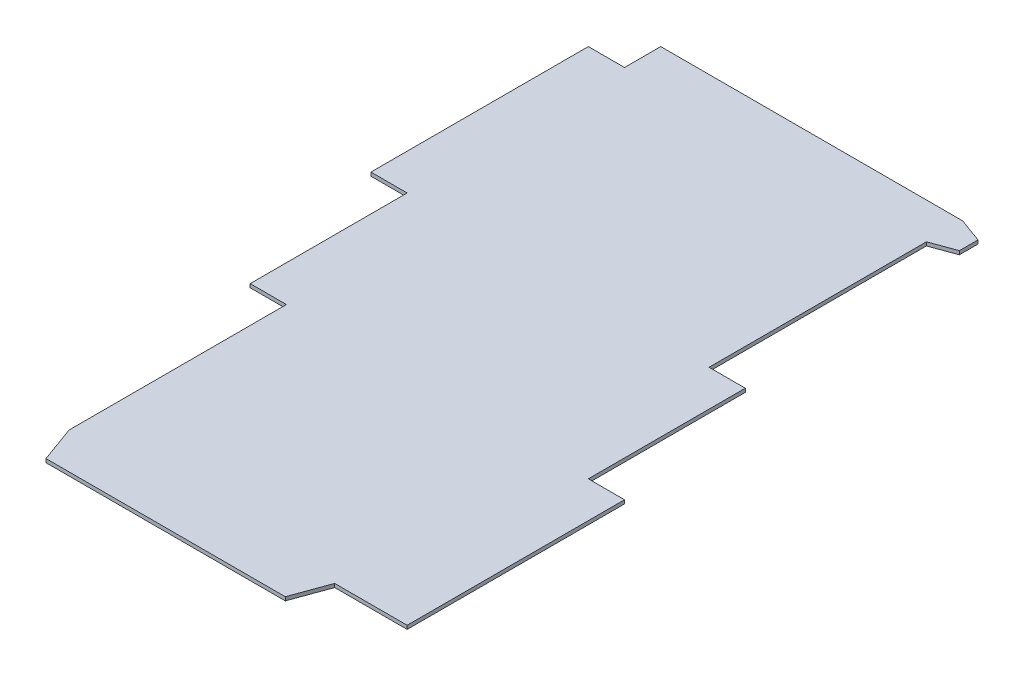
ISO-10303-21;
HEADER;
FILE_DESCRIPTION(('STEP AP214'),'2;1');
FILE_NAME('part.step','',(''),(''),'','','');
FILE_SCHEMA(('AUTOMOTIVE_DESIGN { 1 0 10303 214 1 1 1 1 }'));
ENDSEC;
DATA;
#1=APPLICATION_CONTEXT('core data for automotive mechanical design processes');
#2=APPLICATION_PROTOCOL_DEFINITION('international standard','automotive_design',2000,#1);
#3=PRODUCT_CONTEXT('',#1,'mechanical');
#4=PRODUCT('Part','Part','',(#3));
#5=PRODUCT_RELATED_PRODUCT_CATEGORY('part','',(#4));
#6=PRODUCT_DEFINITION_FORMATION('','',#4);
#7=PRODUCT_DEFINITION_CONTEXT('part definition',#1,'design');
#8=PRODUCT_DEFINITION('design','',#6,#7);
#9=PRODUCT_DEFINITION_SHAPE('','',#8);
#10=(LENGTH_UNIT() NAMED_UNIT(*) SI_UNIT(.MILLI.,.METRE.));
#11=(NAMED_UNIT(*) PLANE_ANGLE_UNIT() SI_UNIT($,.RADIAN.));
#12=(NAMED_UNIT(*) SI_UNIT($,.STERADIAN.) SOLID_ANGLE_UNIT());
#13=UNCERTAINTY_MEASURE_WITH_UNIT(LENGTH_MEASURE(1.E-05),#10,'distance_accuracy_value','');
#14=(GEOMETRIC_REPRESENTATION_CONTEXT(3) GLOBAL_UNCERTAINTY_ASSIGNED_CONTEXT((#13)) GLOBAL_UNIT_ASSIGNED_CONTEXT((#10,
#11,#12)) REPRESENTATION_CONTEXT('',''));
#15=CARTESIAN_POINT('',(0.,0.,0.));
#16=DIRECTION('',(0.,0.,1.));
#17=DIRECTION('',(1.,0.,0.));
#18=AXIS2_PLACEMENT_3D('',#15,#16,#17);
#19=CARTESIAN_POINT('',(0.,1.5,0.));
#20=DIRECTION('',(0.,0.,1.));
#21=DIRECTION('',(1.,0.,0.));
#22=AXIS2_PLACEMENT_3D('',#19,#20,#21);
#23=PLANE('',#22);
#24=DIRECTION('',(-1.,0.,0.));
#25=VECTOR('',#24,1.);
#26=CARTESIAN_POINT('',(0.,0.,0.));
#27=LINE('',#26,#25);
#28=CARTESIAN_POINT('',(15.,0.,0.));
#29=VERTEX_POINT('',#28);
#30=CARTESIAN_POINT('',(0.,0.,0.));
#31=VERTEX_POINT('',#30);
#32=EDGE_CURVE('E212',#29,#31,#27,.T.);
#33=ORIENTED_EDGE('',*,*,#32,.T.);
#34=DIRECTION('',(0.,-1.,0.));
#35=VECTOR('',#34,1.);
#36=CARTESIAN_POINT('',(0.,1.5,0.));
#37=LINE('',#36,#35);
#38=CARTESIAN_POINT('',(0.,1.5,0.));
#39=VERTEX_POINT('',#38);
#40=EDGE_CURVE('E11',#39,#31,#37,.T.);
#41=ORIENTED_EDGE('',*,*,#40,.F.);
#42=DIRECTION('',(-1.,0.,0.));
#43=VECTOR('',#42,1.);
#44=CARTESIAN_POINT('',(0.,1.5,0.));
#45=LINE('',#44,#43);
#46=CARTESIAN_POINT('',(15.,1.5,0.));
#47=VERTEX_POINT('',#46);
#48=EDGE_CURVE('E272',#47,#39,#45,.T.);
#49=ORIENTED_EDGE('',*,*,#48,.F.);
#50=DIRECTION('',(0.,-1.,0.));
#51=VECTOR('',#50,1.);
#52=CARTESIAN_POINT('',(15.,1.5,0.));
#53=LINE('',#52,#51);
#54=EDGE_CURVE('E208',#47,#29,#53,.T.);
#55=ORIENTED_EDGE('',*,*,#54,.T.);
#56=EDGE_LOOP('',(#33,#41,#49,#55));
#57=FACE_BOUND('',#56,.T.);
#58=ADVANCED_FACE('F39',(#57),#23,.F.);
#59=CARTESIAN_POINT('',(0.,1.5,0.));
#60=DIRECTION('',(-1.,0.,0.));
#61=DIRECTION('',(0.,0.,1.));
#62=AXIS2_PLACEMENT_3D('',#59,#60,#61);
#63=PLANE('',#62);
#64=DIRECTION('',(0.,0.,-1.));
#65=VECTOR('',#64,1.);
#66=CARTESIAN_POINT('',(0.,0.,0.));
#67=LINE('',#66,#65);
#68=CARTESIAN_POINT('',(0.,0.,-90.));
#69=VERTEX_POINT('',#68);
#70=EDGE_CURVE('E216',#31,#69,#67,.T.);
#71=ORIENTED_EDGE('',*,*,#70,.T.);
#72=DIRECTION('',(0.,-1.,0.));
#73=VECTOR('',#72,1.);
#74=CARTESIAN_POINT('',(0.,1.5,-90.));
#75=LINE('',#74,#73);
#76=CARTESIAN_POINT('',(0.,1.5,-90.));
#77=VERTEX_POINT('',#76);
#78=EDGE_CURVE('E48',#77,#69,#75,.T.);
#79=ORIENTED_EDGE('',*,*,#78,.F.);
#80=DIRECTION('',(0.,0.,-1.));
#81=VECTOR('',#80,1.);
#82=CARTESIAN_POINT('',(0.,1.5,0.));
#83=LINE('',#82,#81);
#84=EDGE_CURVE('E135',#39,#77,#83,.T.);
#85=ORIENTED_EDGE('',*,*,#84,.F.);
#86=ORIENTED_EDGE('',*,*,#40,.T.);
#87=EDGE_LOOP('',(#71,#79,#85,#86));
#88=FACE_BOUND('',#87,.T.);
#89=ADVANCED_FACE('F420',(#88),#63,.F.);
#90=CARTESIAN_POINT('',(0.,1.5,-90.));
#91=DIRECTION('',(-0.342020143325666,0.,-0.939692620785909));
#92=DIRECTION('',(-0.939692620785909,0.,0.342020143325666));
#93=AXIS2_PLACEMENT_3D('',#90,#91,#92);
#94=PLANE('',#93);
#95=DIRECTION('',(0.939692620785909,0.,-0.342020143325666));
#96=VECTOR('',#95,1.);
#97=CARTESIAN_POINT('',(0.,0.,-90.));
#98=LINE('',#97,#96);
#99=CARTESIAN_POINT('',(10.,0.,-93.639702342662));
#100=VERTEX_POINT('',#99);
#101=EDGE_CURVE('E219',#69,#100,#98,.T.);
#102=ORIENTED_EDGE('',*,*,#101,.T.);
#103=DIRECTION('',(0.,-1.,0.));
#104=VECTOR('',#103,1.);
#105=CARTESIAN_POINT('',(10.,1.5,-93.639702342662));
#106=LINE('',#105,#104);
#107=CARTESIAN_POINT('',(10.,1.5,-93.639702342662));
#108=VERTEX_POINT('',#107);
#109=EDGE_CURVE('E331',#108,#100,#106,.T.);
#110=ORIENTED_EDGE('',*,*,#109,.F.);
#111=DIRECTION('',(0.939692620785909,0.,-0.342020143325666));
#112=VECTOR('',#111,1.);
#113=CARTESIAN_POINT('',(0.,1.5,-90.));
#114=LINE('',#113,#112);
#115=EDGE_CURVE('E341',#77,#108,#114,.T.);
#116=ORIENTED_EDGE('',*,*,#115,.F.);
#117=ORIENTED_EDGE('',*,*,#78,.T.);
#118=EDGE_LOOP('',(#102,#110,#116,#117));
#119=FACE_BOUND('',#118,.T.);
#120=ADVANCED_FACE('F339',(#119),#94,.F.);
#121=CARTESIAN_POINT('',(10.,1.5,-93.639702342662));
#122=DIRECTION('',(-1.,0.,0.));
#123=DIRECTION('',(0.,0.,1.));
#124=AXIS2_PLACEMENT_3D('',#121,#122,#123);
#125=PLANE('',#124);
#126=DIRECTION('',(0.,0.,-1.));
#127=VECTOR('',#126,1.);
#128=CARTESIAN_POINT('',(10.,0.,-93.639702342662));
#129=LINE('',#128,#127);
#130=CARTESIAN_POINT('',(10.,0.,-101.360297657338));
#131=VERTEX_POINT('',#130);
#132=EDGE_CURVE('E222',#100,#131,#129,.T.);
#133=ORIENTED_EDGE('',*,*,#132,.T.);
#134=DIRECTION('',(0.,-1.,0.));
#135=VECTOR('',#134,1.);
#136=CARTESIAN_POINT('',(10.,1.5,-101.360297657338));
#137=LINE('',#136,#135);
#138=CARTESIAN_POINT('',(10.,1.5,-101.360297657338));
#139=VERTEX_POINT('',#138);
#140=EDGE_CURVE('E327',#139,#131,#137,.T.);
#141=ORIENTED_EDGE('',*,*,#140,.F.);
#142=DIRECTION('',(0.,0.,-1.));
#143=VECTOR('',#142,1.);
#144=CARTESIAN_POINT('',(10.,1.5,-93.639702342662));
#145=LINE('',#144,#143);
#146=EDGE_CURVE('E359',#108,#139,#145,.T.);
#147=ORIENTED_EDGE('',*,*,#146,.F.);
#148=ORIENTED_EDGE('',*,*,#109,.T.);
#149=EDGE_LOOP('',(#133,#141,#147,#148));
#150=FACE_BOUND('',#149,.T.);
#151=ADVANCED_FACE('F349',(#150),#125,.F.);
#152=CARTESIAN_POINT('',(10.,1.5,-101.360297657338));
#153=DIRECTION('',(-0.342020143325667,0.,0.939692620785909));
#154=DIRECTION('',(0.939692620785909,0.,0.342020143325667));
#155=AXIS2_PLACEMENT_3D('',#152,#153,#154);
#156=PLANE('',#155);
#157=DIRECTION('',(-0.939692620785909,0.,-0.342020143325667));
#158=VECTOR('',#157,1.);
#159=CARTESIAN_POINT('',(10.,0.,-101.360297657338));
#160=LINE('',#159,#158);
#161=CARTESIAN_POINT('',(0.,0.,-105.));
#162=VERTEX_POINT('',#161);
#163=EDGE_CURVE('E225',#131,#162,#160,.T.);
#164=ORIENTED_EDGE('',*,*,#163,.T.);
#165=DIRECTION('',(0.,-1.,0.));
#166=VECTOR('',#165,1.);
#167=CARTESIAN_POINT('',(0.,1.5,-105.));
#168=LINE('',#167,#166);
#169=CARTESIAN_POINT('',(0.,1.5,-105.));
#170=VERTEX_POINT('',#169);
#171=EDGE_CURVE('E323',#170,#162,#168,.T.);
#172=ORIENTED_EDGE('',*,*,#171,.F.);
#173=DIRECTION('',(-0.939692620785909,0.,-0.342020143325667));
#174=VECTOR('',#173,1.);
#175=CARTESIAN_POINT('',(10.,1.5,-101.360297657338));
#176=LINE('',#175,#174);
#177=EDGE_CURVE('E355',#139,#170,#176,.T.);
#178=ORIENTED_EDGE('',*,*,#177,.F.);
#179=ORIENTED_EDGE('',*,*,#140,.T.);
#180=EDGE_LOOP('',(#164,#172,#178,#179));
#181=FACE_BOUND('',#180,.T.);
#182=ADVANCED_FACE('F353',(#181),#156,.F.);
#183=CARTESIAN_POINT('',(-110.,1.5,-105.));
#184=DIRECTION('',(0.,0.,1.));
#185=DIRECTION('',(1.,0.,0.));
#186=AXIS2_PLACEMENT_3D('',#183,#184,#185);
#187=PLANE('',#186);
#188=DIRECTION('',(-1.,0.,0.));
#189=VECTOR('',#188,1.);
#190=CARTESIAN_POINT('',(-110.,0.,-105.));
#191=LINE('',#190,#189);
#192=CARTESIAN_POINT('',(-125.,0.,-105.));
#193=VERTEX_POINT('',#192);
#194=EDGE_CURVE('E229',#162,#193,#191,.T.);
#195=ORIENTED_EDGE('',*,*,#194,.T.);
#196=DIRECTION('',(0.,-1.,0.));
#197=VECTOR('',#196,1.);
#198=CARTESIAN_POINT('',(-125.,1.5,-105.));
#199=LINE('',#198,#197);
#200=CARTESIAN_POINT('',(-125.,1.5,-105.));
#201=VERTEX_POINT('',#200);
#202=EDGE_CURVE('E319',#201,#193,#199,.T.);
#203=ORIENTED_EDGE('',*,*,#202,.F.);
#204=DIRECTION('',(-1.,0.,0.));
#205=VECTOR('',#204,1.);
#206=CARTESIAN_POINT('',(0.,1.5,-105.));
#207=LINE('',#206,#205);
#208=EDGE_CURVE('E358',#170,#201,#207,.T.);
#209=ORIENTED_EDGE('',*,*,#208,.F.);
#210=ORIENTED_EDGE('',*,*,#171,.T.);
#211=EDGE_LOOP('',(#195,#203,#209,#210));
#212=FACE_BOUND('',#211,.T.);
#213=ADVANCED_FACE('F433',(#212),#187,.F.);
#214=CARTESIAN_POINT('',(-125.,1.5,-105.));
#215=DIRECTION('',(1.,0.,0.));
#216=DIRECTION('',(0.,0.,-1.));
#217=AXIS2_PLACEMENT_3D('',#214,#215,#216);
#218=PLANE('',#217);
#219=DIRECTION('',(0.,0.,1.));
#220=VECTOR('',#219,1.);
#221=CARTESIAN_POINT('',(-125.,0.,-105.));
#222=LINE('',#221,#220);
#223=CARTESIAN_POINT('',(-125.,0.,-90.));
#224=VERTEX_POINT('',#223);
#225=EDGE_CURVE('E232',#193,#224,#222,.T.);
#226=ORIENTED_EDGE('',*,*,#225,.T.);
#227=DIRECTION('',(0.,-1.,0.));
#228=VECTOR('',#227,1.);
#229=CARTESIAN_POINT('',(-125.,1.5,-90.));
#230=LINE('',#229,#228);
#231=CARTESIAN_POINT('',(-125.,1.5,-90.));
#232=VERTEX_POINT('',#231);
#233=EDGE_CURVE('E315',#232,#224,#230,.T.);
#234=ORIENTED_EDGE('',*,*,#233,.F.);
#235=DIRECTION('',(0.,0.,1.));
#236=VECTOR('',#235,1.);
#237=CARTESIAN_POINT('',(-125.,1.5,-105.));
#238=LINE('',#237,#236);
#239=EDGE_CURVE('E363',#201,#232,#238,.T.);
#240=ORIENTED_EDGE('',*,*,#239,.F.);
#241=ORIENTED_EDGE('',*,*,#202,.T.);
#242=EDGE_LOOP('',(#226,#234,#240,#241));
#243=FACE_BOUND('',#242,.T.);
#244=ADVANCED_FACE('F436',(#243),#218,.F.);
#245=CARTESIAN_POINT('',(-140.,1.5,-90.));
#246=DIRECTION('',(0.,0.,1.));
#247=DIRECTION('',(1.,0.,0.));
#248=AXIS2_PLACEMENT_3D('',#245,#246,#247);
#249=PLANE('',#248);
#250=DIRECTION('',(-1.,0.,0.));
#251=VECTOR('',#250,1.);
#252=CARTESIAN_POINT('',(-140.,0.,-90.));
#253=LINE('',#252,#251);
#254=CARTESIAN_POINT('',(-140.,0.,-90.));
#255=VERTEX_POINT('',#254);
#256=EDGE_CURVE('E235',#224,#255,#253,.T.);
#257=ORIENTED_EDGE('',*,*,#256,.T.);
#258=DIRECTION('',(0.,-1.,0.));
#259=VECTOR('',#258,1.);
#260=CARTESIAN_POINT('',(-140.,1.5,-90.));
#261=LINE('',#260,#259);
#262=CARTESIAN_POINT('',(-140.,1.5,-90.));
#263=VERTEX_POINT('',#262);
#264=EDGE_CURVE('E311',#263,#255,#261,.T.);
#265=ORIENTED_EDGE('',*,*,#264,.F.);
#266=DIRECTION('',(-1.,0.,0.));
#267=VECTOR('',#266,1.);
#268=CARTESIAN_POINT('',(-140.,1.5,-90.));
#269=LINE('',#268,#267);
#270=EDGE_CURVE('E370',#232,#263,#269,.T.);
#271=ORIENTED_EDGE('',*,*,#270,.F.);
#272=ORIENTED_EDGE('',*,*,#233,.T.);
#273=EDGE_LOOP('',(#257,#265,#271,#272));
#274=FACE_BOUND('',#273,.T.);
#275=ADVANCED_FACE('F440',(#274),#249,.F.);
#276=CARTESIAN_POINT('',(-140.,1.5,0.));
#277=DIRECTION('',(1.,0.,0.));
#278=DIRECTION('',(0.,0.,-1.));
#279=AXIS2_PLACEMENT_3D('',#276,#277,#278);
#280=PLANE('',#279);
#281=DIRECTION('',(0.,0.,1.));
#282=VECTOR('',#281,1.);
#283=CARTESIAN_POINT('',(-140.,0.,0.));
#284=LINE('',#283,#282);
#285=CARTESIAN_POINT('',(-140.,0.,0.));
#286=VERTEX_POINT('',#285);
#287=EDGE_CURVE('E238',#255,#286,#284,.T.);
#288=ORIENTED_EDGE('',*,*,#287,.T.);
#289=DIRECTION('',(0.,-1.,0.));
#290=VECTOR('',#289,1.);
#291=CARTESIAN_POINT('',(-140.,1.5,0.));
#292=LINE('',#291,#290);
#293=CARTESIAN_POINT('',(-140.,1.5,0.));
#294=VERTEX_POINT('',#293);
#295=EDGE_CURVE('E307',#294,#286,#292,.T.);
#296=ORIENTED_EDGE('',*,*,#295,.F.);
#297=DIRECTION('',(0.,0.,1.));
#298=VECTOR('',#297,1.);
#299=CARTESIAN_POINT('',(-140.,1.5,0.));
#300=LINE('',#299,#298);
#301=EDGE_CURVE('E373',#263,#294,#300,.T.);
#302=ORIENTED_EDGE('',*,*,#301,.F.);
#303=ORIENTED_EDGE('',*,*,#264,.T.);
#304=EDGE_LOOP('',(#288,#296,#302,#303));
#305=FACE_BOUND('',#304,.T.);
#306=ADVANCED_FACE('F444',(#305),#280,.F.);
#307=CARTESIAN_POINT('',(-125.,1.5,0.));
#308=DIRECTION('',(0.,0.,-1.));
#309=DIRECTION('',(-1.,0.,0.));
#310=AXIS2_PLACEMENT_3D('',#307,#308,#309);
#311=PLANE('',#310);
#312=DIRECTION('',(1.,0.,0.));
#313=VECTOR('',#312,1.);
#314=CARTESIAN_POINT('',(-125.,0.,0.));
#315=LINE('',#314,#313);
#316=CARTESIAN_POINT('',(-125.,0.,0.));
#317=VERTEX_POINT('',#316);
#318=EDGE_CURVE('E241',#286,#317,#315,.T.);
#319=ORIENTED_EDGE('',*,*,#318,.T.);
#320=DIRECTION('',(0.,-1.,0.));
#321=VECTOR('',#320,1.);
#322=CARTESIAN_POINT('',(-125.,1.5,0.));
#323=LINE('',#322,#321);
#324=CARTESIAN_POINT('',(-125.,1.5,0.));
#325=VERTEX_POINT('',#324);
#326=EDGE_CURVE('E303',#325,#317,#323,.T.);
#327=ORIENTED_EDGE('',*,*,#326,.F.);
#328=DIRECTION('',(1.,0.,0.));
#329=VECTOR('',#328,1.);
#330=CARTESIAN_POINT('',(-125.,1.5,0.));
#331=LINE('',#330,#329);
#332=EDGE_CURVE('E376',#294,#325,#331,.T.);
#333=ORIENTED_EDGE('',*,*,#332,.F.);
#334=ORIENTED_EDGE('',*,*,#295,.T.);
#335=EDGE_LOOP('',(#319,#327,#333,#334));
#336=FACE_BOUND('',#335,.T.);
#337=ADVANCED_FACE('F448',(#336),#311,.F.);
#338=CARTESIAN_POINT('',(-125.,1.5,0.));
#339=DIRECTION('',(1.,0.,0.));
#340=DIRECTION('',(0.,0.,-1.));
#341=AXIS2_PLACEMENT_3D('',#338,#339,#340);
#342=PLANE('',#341);
#343=DIRECTION('',(0.,0.,1.));
#344=VECTOR('',#343,1.);
#345=CARTESIAN_POINT('',(-125.,0.,0.));
#346=LINE('',#345,#344);
#347=CARTESIAN_POINT('',(-125.,0.,65.));
#348=VERTEX_POINT('',#347);
#349=EDGE_CURVE('E244',#317,#348,#346,.T.);
#350=ORIENTED_EDGE('',*,*,#349,.T.);
#351=DIRECTION('',(0.,-1.,0.));
#352=VECTOR('',#351,1.);
#353=CARTESIAN_POINT('',(-125.,1.5,65.));
#354=LINE('',#353,#352);
#355=CARTESIAN_POINT('',(-125.,1.5,65.));
#356=VERTEX_POINT('',#355);
#357=EDGE_CURVE('E299',#356,#348,#354,.T.);
#358=ORIENTED_EDGE('',*,*,#357,.F.);
#359=DIRECTION('',(0.,0.,1.));
#360=VECTOR('',#359,1.);
#361=CARTESIAN_POINT('',(-125.,1.5,0.));
#362=LINE('',#361,#360);
#363=EDGE_CURVE('E379',#325,#356,#362,.T.);
#364=ORIENTED_EDGE('',*,*,#363,.F.);
#365=ORIENTED_EDGE('',*,*,#326,.T.);
#366=EDGE_LOOP('',(#350,#358,#364,#365));
#367=FACE_BOUND('',#366,.T.);
#368=ADVANCED_FACE('F452',(#367),#342,.F.);
#369=CARTESIAN_POINT('',(-125.,1.5,65.));
#370=DIRECTION('',(0.,0.,-1.));
#371=DIRECTION('',(-1.,0.,0.));
#372=AXIS2_PLACEMENT_3D('',#369,#370,#371);
#373=PLANE('',#372);
#374=DIRECTION('',(1.,0.,0.));
#375=VECTOR('',#374,1.);
#376=CARTESIAN_POINT('',(-125.,0.,65.));
#377=LINE('',#376,#375);
#378=CARTESIAN_POINT('',(-110.,0.,65.));
#379=VERTEX_POINT('',#378);
#380=EDGE_CURVE('E247',#348,#379,#377,.T.);
#381=ORIENTED_EDGE('',*,*,#380,.T.);
#382=DIRECTION('',(0.,-1.,0.));
#383=VECTOR('',#382,1.);
#384=CARTESIAN_POINT('',(-110.,1.5,65.));
#385=LINE('',#384,#383);
#386=CARTESIAN_POINT('',(-110.,1.5,65.));
#387=VERTEX_POINT('',#386);
#388=EDGE_CURVE('E295',#387,#379,#385,.T.);
#389=ORIENTED_EDGE('',*,*,#388,.F.);
#390=DIRECTION('',(1.,0.,0.));
#391=VECTOR('',#390,1.);
#392=CARTESIAN_POINT('',(-125.,1.5,65.));
#393=LINE('',#392,#391);
#394=EDGE_CURVE('E382',#356,#387,#393,.T.);
#395=ORIENTED_EDGE('',*,*,#394,.F.);
#396=ORIENTED_EDGE('',*,*,#357,.T.);
#397=EDGE_LOOP('',(#381,#389,#395,#396));
#398=FACE_BOUND('',#397,.T.);
#399=ADVANCED_FACE('F456',(#398),#373,.F.);
#400=CARTESIAN_POINT('',(-110.,1.5,65.));
#401=DIRECTION('',(1.,0.,0.));
#402=DIRECTION('',(0.,0.,-1.));
#403=AXIS2_PLACEMENT_3D('',#400,#401,#402);
#404=PLANE('',#403);
#405=DIRECTION('',(0.,0.,1.));
#406=VECTOR('',#405,1.);
#407=CARTESIAN_POINT('',(-110.,0.,65.));
#408=LINE('',#407,#406);
#409=CARTESIAN_POINT('',(-110.,0.,155.));
#410=VERTEX_POINT('',#409);
#411=EDGE_CURVE('E250',#379,#410,#408,.T.);
#412=ORIENTED_EDGE('',*,*,#411,.T.);
#413=DIRECTION('',(0.,-1.,0.));
#414=VECTOR('',#413,1.);
#415=CARTESIAN_POINT('',(-110.,1.5,155.));
#416=LINE('',#415,#414);
#417=CARTESIAN_POINT('',(-110.,1.5,155.));
#418=VERTEX_POINT('',#417);
#419=EDGE_CURVE('E291',#418,#410,#416,.T.);
#420=ORIENTED_EDGE('',*,*,#419,.F.);
#421=DIRECTION('',(0.,0.,1.));
#422=VECTOR('',#421,1.);
#423=CARTESIAN_POINT('',(-110.,1.5,65.));
#424=LINE('',#423,#422);
#425=EDGE_CURVE('E385',#387,#418,#424,.T.);
#426=ORIENTED_EDGE('',*,*,#425,.F.);
#427=ORIENTED_EDGE('',*,*,#388,.T.);
#428=EDGE_LOOP('',(#412,#420,#426,#427));
#429=FACE_BOUND('',#428,.T.);
#430=ADVANCED_FACE('F460',(#429),#404,.F.);
#431=CARTESIAN_POINT('',(-110.,1.5,155.));
#432=DIRECTION('',(0.939692620785908,0.,-0.34202014332567));
#433=DIRECTION('',(-0.34202014332567,0.,-0.939692620785908));
#434=AXIS2_PLACEMENT_3D('',#431,#432,#433);
#435=PLANE('',#434);
#436=DIRECTION('',(0.342020143325669,0.,0.939692620785908));
#437=VECTOR('',#436,1.);
#438=CARTESIAN_POINT('',(-110.,0.,155.));
#439=LINE('',#438,#437);
#440=CARTESIAN_POINT('',(-104.540446486007,0.,170.));
#441=VERTEX_POINT('',#440);
#442=EDGE_CURVE('E253',#410,#441,#439,.T.);
#443=ORIENTED_EDGE('',*,*,#442,.T.);
#444=DIRECTION('',(0.,-1.,0.));
#445=VECTOR('',#444,1.);
#446=CARTESIAN_POINT('',(-104.540446486007,1.5,170.));
#447=LINE('',#446,#445);
#448=CARTESIAN_POINT('',(-104.540446486007,1.5,170.));
#449=VERTEX_POINT('',#448);
#450=EDGE_CURVE('E287',#449,#441,#447,.T.);
#451=ORIENTED_EDGE('',*,*,#450,.F.);
#452=DIRECTION('',(0.342020143325669,0.,0.939692620785908));
#453=VECTOR('',#452,1.);
#454=CARTESIAN_POINT('',(-110.,1.5,155.));
#455=LINE('',#454,#453);
#456=EDGE_CURVE('E388',#418,#449,#455,.T.);
#457=ORIENTED_EDGE('',*,*,#456,.F.);
#458=ORIENTED_EDGE('',*,*,#419,.T.);
#459=EDGE_LOOP('',(#443,#451,#457,#458));
#460=FACE_BOUND('',#459,.T.);
#461=ADVANCED_FACE('F464',(#460),#435,.F.);
#462=CARTESIAN_POINT('',(-104.540446486007,1.5,170.));
#463=DIRECTION('',(0.,0.,-1.));
#464=DIRECTION('',(-1.,0.,0.));
#465=AXIS2_PLACEMENT_3D('',#462,#463,#464);
#466=PLANE('',#465);
#467=DIRECTION('',(1.,0.,0.));
#468=VECTOR('',#467,1.);
#469=CARTESIAN_POINT('',(-104.540446486007,0.,170.));
#470=LINE('',#469,#468);
#471=CARTESIAN_POINT('',(-5.45955351399291,0.,170.));
#472=VERTEX_POINT('',#471);
#473=EDGE_CURVE('E256',#441,#472,#470,.T.);
#474=ORIENTED_EDGE('',*,*,#473,.T.);
#475=DIRECTION('',(0.,-1.,0.));
#476=VECTOR('',#475,1.);
#477=CARTESIAN_POINT('',(-5.45955351399291,1.5,170.));
#478=LINE('',#477,#476);
#479=CARTESIAN_POINT('',(-5.45955351399291,1.5,170.));
#480=VERTEX_POINT('',#479);
#481=EDGE_CURVE('E283',#480,#472,#478,.T.);
#482=ORIENTED_EDGE('',*,*,#481,.F.);
#483=DIRECTION('',(1.,0.,0.));
#484=VECTOR('',#483,1.);
#485=CARTESIAN_POINT('',(-104.540446486007,1.5,170.));
#486=LINE('',#485,#484);
#487=EDGE_CURVE('E391',#449,#480,#486,.T.);
#488=ORIENTED_EDGE('',*,*,#487,.F.);
#489=ORIENTED_EDGE('',*,*,#450,.T.);
#490=EDGE_LOOP('',(#474,#482,#488,#489));
#491=FACE_BOUND('',#490,.T.);
#492=ADVANCED_FACE('F468',(#491),#466,.F.);
#493=CARTESIAN_POINT('',(-5.45955351399291,1.5,170.));
#494=DIRECTION('',(-0.939692620785911,0.,-0.342020143325663));
#495=DIRECTION('',(-0.342020143325663,0.,0.939692620785911));
#496=AXIS2_PLACEMENT_3D('',#493,#494,#495);
#497=PLANE('',#496);
#498=DIRECTION('',(0.342020143325663,0.,-0.939692620785911));
#499=VECTOR('',#498,1.);
#500=CARTESIAN_POINT('',(-5.45955351399291,0.,170.));
#501=LINE('',#500,#499);
#502=CARTESIAN_POINT('',(0.,0.,155.));
#503=VERTEX_POINT('',#502);
#504=EDGE_CURVE('E259',#472,#503,#501,.T.);
#505=ORIENTED_EDGE('',*,*,#504,.T.);
#506=DIRECTION('',(0.,-1.,0.));
#507=VECTOR('',#506,1.);
#508=CARTESIAN_POINT('',(0.,1.5,155.));
#509=LINE('',#508,#507);
#510=CARTESIAN_POINT('',(0.,1.5,155.));
#511=VERTEX_POINT('',#510);
#512=EDGE_CURVE('E279',#511,#503,#509,.T.);
#513=ORIENTED_EDGE('',*,*,#512,.F.);
#514=DIRECTION('',(0.342020143325663,0.,-0.939692620785911));
#515=VECTOR('',#514,1.);
#516=CARTESIAN_POINT('',(-5.45955351399291,1.5,170.));
#517=LINE('',#516,#515);
#518=EDGE_CURVE('E394',#480,#511,#517,.T.);
#519=ORIENTED_EDGE('',*,*,#518,.F.);
#520=ORIENTED_EDGE('',*,*,#481,.T.);
#521=EDGE_LOOP('',(#505,#513,#519,#520));
#522=FACE_BOUND('',#521,.T.);
#523=ADVANCED_FACE('F402',(#522),#497,.F.);
#524=CARTESIAN_POINT('',(30.,1.5,155.));
#525=DIRECTION('',(0.,0.,-1.));
#526=DIRECTION('',(-1.,0.,0.));
#527=AXIS2_PLACEMENT_3D('',#524,#525,#526);
#528=PLANE('',#527);
#529=DIRECTION('',(1.,0.,0.));
#530=VECTOR('',#529,1.);
#531=CARTESIAN_POINT('',(30.,0.,155.));
#532=LINE('',#531,#530);
#533=CARTESIAN_POINT('',(30.,0.,155.));
#534=VERTEX_POINT('',#533);
#535=EDGE_CURVE('E263',#503,#534,#532,.T.);
#536=ORIENTED_EDGE('',*,*,#535,.T.);
#537=DIRECTION('',(0.,-1.,0.));
#538=VECTOR('',#537,1.);
#539=CARTESIAN_POINT('',(30.,1.5,155.));
#540=LINE('',#539,#538);
#541=CARTESIAN_POINT('',(30.,1.5,155.));
#542=VERTEX_POINT('',#541);
#543=EDGE_CURVE('E201',#542,#534,#540,.T.);
#544=ORIENTED_EDGE('',*,*,#543,.F.);
#545=DIRECTION('',(1.,0.,0.));
#546=VECTOR('',#545,1.);
#547=CARTESIAN_POINT('',(15.,1.5,155.));
#548=LINE('',#547,#546);
#549=EDGE_CURVE('E190',#511,#542,#548,.T.);
#550=ORIENTED_EDGE('',*,*,#549,.F.);
#551=ORIENTED_EDGE('',*,*,#512,.T.);
#552=EDGE_LOOP('',(#536,#544,#550,#551));
#553=FACE_BOUND('',#552,.T.);
#554=ADVANCED_FACE('F405',(#553),#528,.F.);
#555=CARTESIAN_POINT('',(30.,1.5,65.));
#556=DIRECTION('',(-1.,0.,0.));
#557=DIRECTION('',(0.,0.,1.));
#558=AXIS2_PLACEMENT_3D('',#555,#556,#557);
#559=PLANE('',#558);
#560=DIRECTION('',(0.,0.,-1.));
#561=VECTOR('',#560,1.);
#562=CARTESIAN_POINT('',(30.,0.,65.));
#563=LINE('',#562,#561);
#564=CARTESIAN_POINT('',(30.,0.,65.));
#565=VERTEX_POINT('',#564);
#566=EDGE_CURVE('E199',#534,#565,#563,.T.);
#567=ORIENTED_EDGE('',*,*,#566,.T.);
#568=DIRECTION('',(0.,-1.,0.));
#569=VECTOR('',#568,1.);
#570=CARTESIAN_POINT('',(30.,1.5,65.));
#571=LINE('',#570,#569);
#572=CARTESIAN_POINT('',(30.,1.5,65.));
#573=VERTEX_POINT('',#572);
#574=EDGE_CURVE('E196',#573,#565,#571,.T.);
#575=ORIENTED_EDGE('',*,*,#574,.F.);
#576=DIRECTION('',(0.,0.,-1.));
#577=VECTOR('',#576,1.);
#578=CARTESIAN_POINT('',(30.,1.5,65.));
#579=LINE('',#578,#577);
#580=EDGE_CURVE('E184',#542,#573,#579,.T.);
#581=ORIENTED_EDGE('',*,*,#580,.F.);
#582=ORIENTED_EDGE('',*,*,#543,.T.);
#583=EDGE_LOOP('',(#567,#575,#581,#582));
#584=FACE_BOUND('',#583,.T.);
#585=ADVANCED_FACE('F197',(#584),#559,.F.);
#586=CARTESIAN_POINT('',(15.,1.5,65.));
#587=DIRECTION('',(0.,0.,1.));
#588=DIRECTION('',(1.,0.,0.));
#589=AXIS2_PLACEMENT_3D('',#586,#587,#588);
#590=PLANE('',#589);
#591=DIRECTION('',(-1.,0.,0.));
#592=VECTOR('',#591,1.);
#593=CARTESIAN_POINT('',(15.,0.,65.));
#594=LINE('',#593,#592);
#595=CARTESIAN_POINT('',(15.,0.,65.));
#596=VERTEX_POINT('',#595);
#597=EDGE_CURVE('E121',#565,#596,#594,.T.);
#598=ORIENTED_EDGE('',*,*,#597,.T.);
#599=DIRECTION('',(0.,-1.,0.));
#600=VECTOR('',#599,1.);
#601=CARTESIAN_POINT('',(15.,1.5,65.));
#602=LINE('',#601,#600);
#603=CARTESIAN_POINT('',(15.,1.5,65.));
#604=VERTEX_POINT('',#603);
#605=EDGE_CURVE('E202',#604,#596,#602,.T.);
#606=ORIENTED_EDGE('',*,*,#605,.F.);
#607=DIRECTION('',(-1.,0.,0.));
#608=VECTOR('',#607,1.);
#609=CARTESIAN_POINT('',(15.,1.5,65.));
#610=LINE('',#609,#608);
#611=EDGE_CURVE('E188',#573,#604,#610,.T.);
#612=ORIENTED_EDGE('',*,*,#611,.F.);
#613=ORIENTED_EDGE('',*,*,#574,.T.);
#614=EDGE_LOOP('',(#598,#606,#612,#613));
#615=FACE_BOUND('',#614,.T.);
#616=ADVANCED_FACE('F204',(#615),#590,.F.);
#617=CARTESIAN_POINT('',(15.,1.5,0.));
#618=DIRECTION('',(-1.,0.,0.));
#619=DIRECTION('',(0.,0.,1.));
#620=AXIS2_PLACEMENT_3D('',#617,#618,#619);
#621=PLANE('',#620);
#622=DIRECTION('',(0.,0.,-1.));
#623=VECTOR('',#622,1.);
#624=CARTESIAN_POINT('',(15.,0.,0.));
#625=LINE('',#624,#623);
#626=EDGE_CURVE('E127',#596,#29,#625,.T.);
#627=ORIENTED_EDGE('',*,*,#626,.T.);
#628=ORIENTED_EDGE('',*,*,#54,.F.);
#629=DIRECTION('',(0.,0.,-1.));
#630=VECTOR('',#629,1.);
#631=CARTESIAN_POINT('',(15.,1.5,0.));
#632=LINE('',#631,#630);
#633=EDGE_CURVE('E56',#604,#47,#632,.T.);
#634=ORIENTED_EDGE('',*,*,#633,.F.);
#635=ORIENTED_EDGE('',*,*,#605,.T.);
#636=EDGE_LOOP('',(#627,#628,#634,#635));
#637=FACE_BOUND('',#636,.T.);
#638=ADVANCED_FACE('F409',(#637),#621,.F.);
#639=CARTESIAN_POINT('',(0.,1.5,0.));
#640=DIRECTION('',(0.,-1.,0.));
#641=DIRECTION('',(0.,0.,-1.));
#642=AXIS2_PLACEMENT_3D('',#639,#640,#641);
#643=PLANE('',#642);
#644=ORIENTED_EDGE('',*,*,#48,.T.);
#645=ORIENTED_EDGE('',*,*,#84,.T.);
#646=ORIENTED_EDGE('',*,*,#115,.T.);
#647=ORIENTED_EDGE('',*,*,#146,.T.);
#648=ORIENTED_EDGE('',*,*,#177,.T.);
#649=ORIENTED_EDGE('',*,*,#208,.T.);
#650=ORIENTED_EDGE('',*,*,#239,.T.);
#651=ORIENTED_EDGE('',*,*,#270,.T.);
#652=ORIENTED_EDGE('',*,*,#301,.T.);
#653=ORIENTED_EDGE('',*,*,#332,.T.);
#654=ORIENTED_EDGE('',*,*,#363,.T.);
#655=ORIENTED_EDGE('',*,*,#394,.T.);
#656=ORIENTED_EDGE('',*,*,#425,.T.);
#657=ORIENTED_EDGE('',*,*,#456,.T.);
#658=ORIENTED_EDGE('',*,*,#487,.T.);
#659=ORIENTED_EDGE('',*,*,#518,.T.);
#660=ORIENTED_EDGE('',*,*,#549,.T.);
#661=ORIENTED_EDGE('',*,*,#580,.T.);
#662=ORIENTED_EDGE('',*,*,#611,.T.);
#663=ORIENTED_EDGE('',*,*,#633,.T.);
#664=EDGE_LOOP('',(#644,#645,#646,#647,#648,#649,#650,#651,#652,#653,#654,#655,#656,#657,#658,
#659,#660,#661,#662,#663));
#665=FACE_BOUND('',#664,.T.);
#666=ADVANCED_FACE('F186',(#665),#643,.F.);
#667=CARTESIAN_POINT('',(0.,0.,0.));
#668=DIRECTION('',(0.,-1.,0.));
#669=DIRECTION('',(0.,0.,-1.));
#670=AXIS2_PLACEMENT_3D('',#667,#668,#669);
#671=PLANE('',#670);
#672=ORIENTED_EDGE('',*,*,#32,.F.);
#673=ORIENTED_EDGE('',*,*,#626,.F.);
#674=ORIENTED_EDGE('',*,*,#597,.F.);
#675=ORIENTED_EDGE('',*,*,#566,.F.);
#676=ORIENTED_EDGE('',*,*,#535,.F.);
#677=ORIENTED_EDGE('',*,*,#504,.F.);
#678=ORIENTED_EDGE('',*,*,#473,.F.);
#679=ORIENTED_EDGE('',*,*,#442,.F.);
#680=ORIENTED_EDGE('',*,*,#411,.F.);
#681=ORIENTED_EDGE('',*,*,#380,.F.);
#682=ORIENTED_EDGE('',*,*,#349,.F.);
#683=ORIENTED_EDGE('',*,*,#318,.F.);
#684=ORIENTED_EDGE('',*,*,#287,.F.);
#685=ORIENTED_EDGE('',*,*,#256,.F.);
#686=ORIENTED_EDGE('',*,*,#225,.F.);
#687=ORIENTED_EDGE('',*,*,#194,.F.);
#688=ORIENTED_EDGE('',*,*,#163,.F.);
#689=ORIENTED_EDGE('',*,*,#132,.F.);
#690=ORIENTED_EDGE('',*,*,#101,.F.);
#691=ORIENTED_EDGE('',*,*,#70,.F.);
#692=EDGE_LOOP('',(#672,#673,#674,#675,#676,#677,#678,#679,#680,#681,#682,#683,#684,#685,#686,
#687,#688,#689,#690,#691));
#693=FACE_BOUND('',#692,.T.);
#694=ADVANCED_FACE('F345',(#693),#671,.T.);
#695=CLOSED_SHELL('',(#58,#89,#120,#151,#182,#213,#244,#275,#306,#337,#368,#399,#430,#461,#492,
#523,#554,#585,#616,#638,#666,#694));
#696=MANIFOLD_SOLID_BREP('B2',#695);
#697=ADVANCED_BREP_SHAPE_REPRESENTATION('',(#18,#696),#14);
#698=SHAPE_DEFINITION_REPRESENTATION(#9,#697);
ENDSEC;
END-ISO-10303-21;
